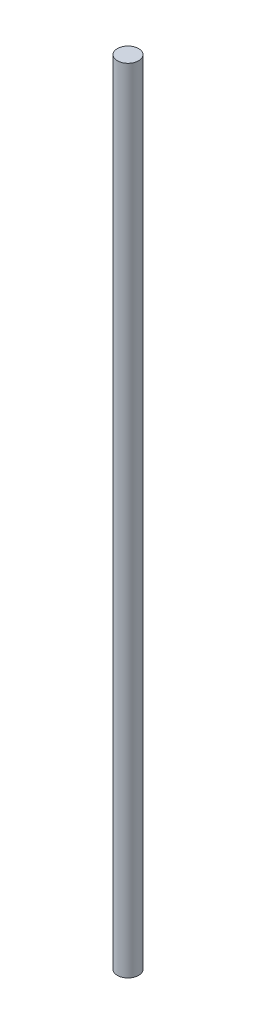
ISO-10303-21;
HEADER;
FILE_DESCRIPTION(('STEP AP214'),'2;1');
FILE_NAME('part.step','',(''),(''),'','','');
FILE_SCHEMA(('AUTOMOTIVE_DESIGN { 1 0 10303 214 1 1 1 1 }'));
ENDSEC;
DATA;
#1=APPLICATION_CONTEXT('core data for automotive mechanical design processes');
#2=APPLICATION_PROTOCOL_DEFINITION('international standard','automotive_design',2000,#1);
#3=PRODUCT_CONTEXT('',#1,'mechanical');
#4=PRODUCT('Part','Part','',(#3));
#5=PRODUCT_RELATED_PRODUCT_CATEGORY('part','',(#4));
#6=PRODUCT_DEFINITION_FORMATION('','',#4);
#7=PRODUCT_DEFINITION_CONTEXT('part definition',#1,'design');
#8=PRODUCT_DEFINITION('design','',#6,#7);
#9=PRODUCT_DEFINITION_SHAPE('','',#8);
#10=(LENGTH_UNIT() NAMED_UNIT(*) SI_UNIT(.MILLI.,.METRE.));
#11=(NAMED_UNIT(*) PLANE_ANGLE_UNIT() SI_UNIT($,.RADIAN.));
#12=(NAMED_UNIT(*) SI_UNIT($,.STERADIAN.) SOLID_ANGLE_UNIT());
#13=UNCERTAINTY_MEASURE_WITH_UNIT(LENGTH_MEASURE(1.E-05),#10,'distance_accuracy_value','');
#14=(GEOMETRIC_REPRESENTATION_CONTEXT(3) GLOBAL_UNCERTAINTY_ASSIGNED_CONTEXT((#13)) GLOBAL_UNIT_ASSIGNED_CONTEXT((#10,
#11,#12)) REPRESENTATION_CONTEXT('',''));
#15=CARTESIAN_POINT('',(0.,0.,0.));
#16=DIRECTION('',(0.,0.,1.));
#17=DIRECTION('',(1.,0.,0.));
#18=AXIS2_PLACEMENT_3D('',#15,#16,#17);
#19=CARTESIAN_POINT('',(0.,-224.,0.));
#20=DIRECTION('',(0.,1.,0.));
#21=DIRECTION('',(0.,0.,1.));
#22=AXIS2_PLACEMENT_3D('',#19,#20,#21);
#23=CYLINDRICAL_SURFACE('',#22,6.);
#24=CARTESIAN_POINT('',(0.,-224.,0.));
#25=DIRECTION('',(0.,1.,0.));
#26=DIRECTION('',(0.,0.,1.));
#27=AXIS2_PLACEMENT_3D('',#24,#25,#26);
#28=CIRCLE('',#27,6.);
#29=CARTESIAN_POINT('',(0.,-224.,6.));
#30=VERTEX_POINT('',#29);
#31=EDGE_CURVE('E10',#30,#30,#28,.T.);
#32=ORIENTED_EDGE('',*,*,#31,.T.);
#33=EDGE_LOOP('',(#32));
#34=FACE_BOUND('',#33,.T.);
#35=CARTESIAN_POINT('',(0.,224.,0.));
#36=DIRECTION('',(0.,1.,0.));
#37=DIRECTION('',(0.,0.,1.));
#38=AXIS2_PLACEMENT_3D('',#35,#36,#37);
#39=CIRCLE('',#38,6.);
#40=CARTESIAN_POINT('',(0.,224.,6.));
#41=VERTEX_POINT('',#40);
#42=EDGE_CURVE('E38',#41,#41,#39,.T.);
#43=ORIENTED_EDGE('',*,*,#42,.F.);
#44=EDGE_LOOP('',(#43));
#45=FACE_BOUND('',#44,.T.);
#46=ADVANCED_FACE('F32',(#34,#45),#23,.T.);
#47=CARTESIAN_POINT('',(0.,-224.,0.));
#48=DIRECTION('',(0.,1.,0.));
#49=DIRECTION('',(0.,0.,1.));
#50=AXIS2_PLACEMENT_3D('',#47,#48,#49);
#51=PLANE('',#50);
#52=ORIENTED_EDGE('',*,*,#31,.F.);
#53=EDGE_LOOP('',(#52));
#54=FACE_BOUND('',#53,.T.);
#55=ADVANCED_FACE('F47',(#54),#51,.F.);
#56=CARTESIAN_POINT('',(0.,224.,0.));
#57=DIRECTION('',(0.,1.,0.));
#58=DIRECTION('',(0.,0.,1.));
#59=AXIS2_PLACEMENT_3D('',#56,#57,#58);
#60=PLANE('',#59);
#61=ORIENTED_EDGE('',*,*,#42,.T.);
#62=EDGE_LOOP('',(#61));
#63=FACE_BOUND('',#62,.T.);
#64=ADVANCED_FACE('F44',(#63),#60,.T.);
#65=CLOSED_SHELL('',(#46,#55,#64));
#66=MANIFOLD_SOLID_BREP('B2',#65);
#67=ADVANCED_BREP_SHAPE_REPRESENTATION('',(#18,#66),#14);
#68=SHAPE_DEFINITION_REPRESENTATION(#9,#67);
ENDSEC;
END-ISO-10303-21;
